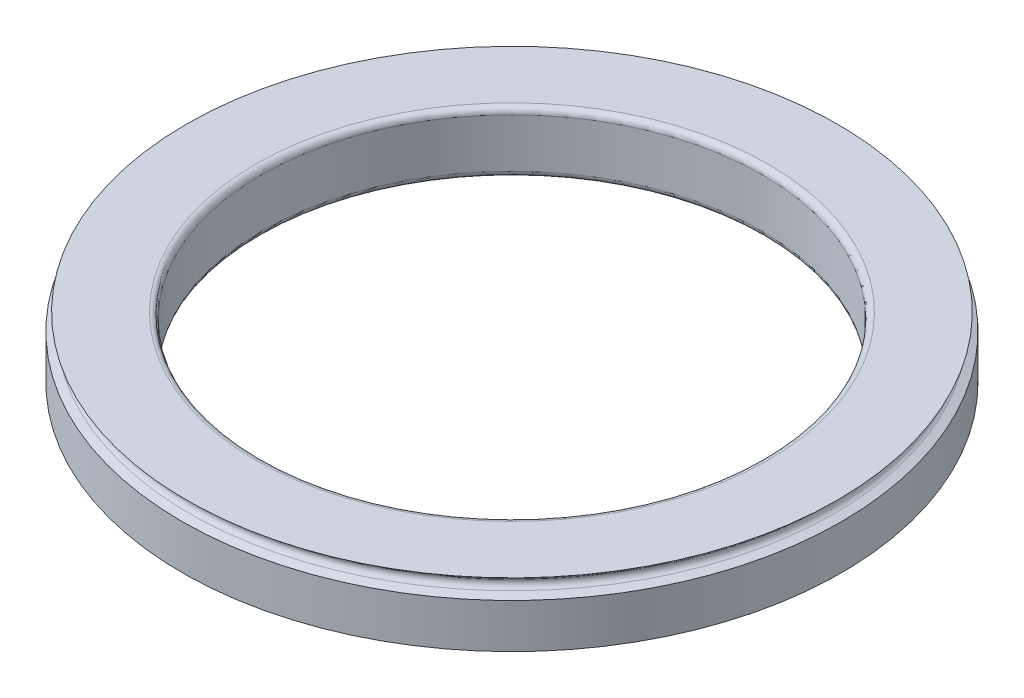
ISO-10303-21;
HEADER;
FILE_DESCRIPTION(('STEP AP214'),'2;1');
FILE_NAME('part.step','',(''),(''),'','','');
FILE_SCHEMA(('AUTOMOTIVE_DESIGN { 1 0 10303 214 1 1 1 1 }'));
ENDSEC;
DATA;
#1=APPLICATION_CONTEXT('core data for automotive mechanical design processes');
#2=APPLICATION_PROTOCOL_DEFINITION('international standard','automotive_design',2000,#1);
#3=PRODUCT_CONTEXT('',#1,'mechanical');
#4=PRODUCT('Part','Part','',(#3));
#5=PRODUCT_RELATED_PRODUCT_CATEGORY('part','',(#4));
#6=PRODUCT_DEFINITION_FORMATION('','',#4);
#7=PRODUCT_DEFINITION_CONTEXT('part definition',#1,'design');
#8=PRODUCT_DEFINITION('design','',#6,#7);
#9=PRODUCT_DEFINITION_SHAPE('','',#8);
#10=(LENGTH_UNIT() NAMED_UNIT(*) SI_UNIT(.MILLI.,.METRE.));
#11=(NAMED_UNIT(*) PLANE_ANGLE_UNIT() SI_UNIT($,.RADIAN.));
#12=(NAMED_UNIT(*) SI_UNIT($,.STERADIAN.) SOLID_ANGLE_UNIT());
#13=UNCERTAINTY_MEASURE_WITH_UNIT(LENGTH_MEASURE(1.E-05),#10,'distance_accuracy_value','');
#14=(GEOMETRIC_REPRESENTATION_CONTEXT(3) GLOBAL_UNCERTAINTY_ASSIGNED_CONTEXT((#13)) GLOBAL_UNIT_ASSIGNED_CONTEXT((#10,
#11,#12)) REPRESENTATION_CONTEXT('',''));
#15=CARTESIAN_POINT('',(0.,0.,0.));
#16=DIRECTION('',(0.,0.,1.));
#17=DIRECTION('',(1.,0.,0.));
#18=AXIS2_PLACEMENT_3D('',#15,#16,#17);
#19=CARTESIAN_POINT('',(42.43524478544,6.448403263981,-24.5));
#20=DIRECTION('',(0.,-1.,0.));
#21=DIRECTION('',(-0.500000000000017,0.,-0.866025403784429));
#22=AXIS2_PLACEMENT_3D('',#19,#20,#21);
#23=CONICAL_SURFACE('',#22,0.9037316479378,1.02974425867665);
#24=DIRECTION('',(0.42858365035107,-0.515038074910054,0.742328657701356));
#25=VECTOR('',#24,1.);
#26=CARTESIAN_POINT('',(42.8871106094089,6.448403263981,-23.7173454346819));
#27=LINE('',#26,#25);
#28=CARTESIAN_POINT('',(42.43524478544,6.991420021395,-24.5));
#29=VERTEX_POINT('',#28);
#30=CARTESIAN_POINT('',(43.26024478544,6.,-23.0710580837557));
#31=VERTEX_POINT('',#30);
#32=EDGE_CURVE('E11',#29,#31,#27,.T.);
#33=ORIENTED_EDGE('',*,*,#32,.T.);
#34=CARTESIAN_POINT('',(42.43524478544,6.,-24.5));
#35=DIRECTION('',(0.,-1.,0.));
#36=DIRECTION('',(-0.500000000000017,0.,-0.866025403784429));
#37=AXIS2_PLACEMENT_3D('',#34,#35,#36);
#38=CIRCLE('',#37,1.65);
#39=EDGE_CURVE('E189',#31,#31,#38,.T.);
#40=ORIENTED_EDGE('',*,*,#39,.T.);
#41=ORIENTED_EDGE('',*,*,#32,.F.);
#42=EDGE_LOOP('',(#33,#40,#41));
#43=FACE_BOUND('',#42,.T.);
#44=ADVANCED_FACE('F17',(#43),#23,.F.);
#45=CARTESIAN_POINT('',(42.43524478544,7.340991022465,-24.5));
#46=DIRECTION('',(0.,-1.,0.));
#47=DIRECTION('',(-0.500000000000017,0.,-0.866025403784429));
#48=AXIS2_PLACEMENT_3D('',#45,#46,#47);
#49=CYLINDRICAL_SURFACE('',#48,1.65);
#50=ORIENTED_EDGE('',*,*,#39,.F.);
#51=DIRECTION('',(0.,-1.,0.));
#52=VECTOR('',#51,1.);
#53=CARTESIAN_POINT('',(43.26024478544,7.340991022465,-23.0710580837557));
#54=LINE('',#53,#52);
#55=CARTESIAN_POINT('',(43.26024478544,0.,-23.0710580837557));
#56=VERTEX_POINT('',#55);
#57=EDGE_CURVE('E28',#31,#56,#54,.T.);
#58=ORIENTED_EDGE('',*,*,#57,.T.);
#59=CARTESIAN_POINT('',(42.43524478544,0.,-24.5));
#60=DIRECTION('',(0.,-1.,0.));
#61=DIRECTION('',(-0.500000000000017,0.,-0.866025403784429));
#62=AXIS2_PLACEMENT_3D('',#59,#60,#61);
#63=CIRCLE('',#62,1.65);
#64=EDGE_CURVE('E257',#56,#56,#63,.T.);
#65=ORIENTED_EDGE('',*,*,#64,.T.);
#66=ORIENTED_EDGE('',*,*,#57,.F.);
#67=EDGE_LOOP('',(#50,#58,#65,#66));
#68=FACE_BOUND('',#67,.T.);
#69=ADVANCED_FACE('F292',(#68),#49,.F.);
#70=CARTESIAN_POINT('',(42.43524478544,6.448403263981,24.5));
#71=DIRECTION('',(0.,-1.,0.));
#72=DIRECTION('',(0.500000000000017,0.,-0.866025403784429));
#73=AXIS2_PLACEMENT_3D('',#70,#71,#72);
#74=CONICAL_SURFACE('',#73,0.9037316479378,1.02974425867665);
#75=DIRECTION('',(-0.428583650351071,-0.515038074910054,0.742328657701356));
#76=VECTOR('',#75,1.);
#77=CARTESIAN_POINT('',(41.9833789614711,6.448403263981,25.2826545653181));
#78=LINE('',#77,#76);
#79=CARTESIAN_POINT('',(42.43524478544,6.991420021395,24.5));
#80=VERTEX_POINT('',#79);
#81=CARTESIAN_POINT('',(41.61024478544,6.,25.9289419162443));
#82=VERTEX_POINT('',#81);
#83=EDGE_CURVE('E184',#80,#82,#78,.T.);
#84=ORIENTED_EDGE('',*,*,#83,.T.);
#85=CARTESIAN_POINT('',(42.43524478544,6.,24.5));
#86=DIRECTION('',(0.,-1.,0.));
#87=DIRECTION('',(0.500000000000017,0.,-0.866025403784429));
#88=AXIS2_PLACEMENT_3D('',#85,#86,#87);
#89=CIRCLE('',#88,1.65);
#90=EDGE_CURVE('E185',#82,#82,#89,.T.);
#91=ORIENTED_EDGE('',*,*,#90,.T.);
#92=ORIENTED_EDGE('',*,*,#83,.F.);
#93=EDGE_LOOP('',(#84,#91,#92));
#94=FACE_BOUND('',#93,.T.);
#95=ADVANCED_FACE('F300',(#94),#74,.F.);
#96=CARTESIAN_POINT('',(42.43524478544,7.340991022465,24.5));
#97=DIRECTION('',(0.,-1.,0.));
#98=DIRECTION('',(0.500000000000017,0.,-0.866025403784429));
#99=AXIS2_PLACEMENT_3D('',#96,#97,#98);
#100=CYLINDRICAL_SURFACE('',#99,1.65);
#101=ORIENTED_EDGE('',*,*,#90,.F.);
#102=DIRECTION('',(0.,-1.,0.));
#103=VECTOR('',#102,1.);
#104=CARTESIAN_POINT('',(41.61024478544,7.340991022465,25.9289419162443));
#105=LINE('',#104,#103);
#106=CARTESIAN_POINT('',(41.61024478544,0.,25.9289419162443));
#107=VERTEX_POINT('',#106);
#108=EDGE_CURVE('E181',#82,#107,#105,.T.);
#109=ORIENTED_EDGE('',*,*,#108,.T.);
#110=CARTESIAN_POINT('',(42.43524478544,0.,24.5));
#111=DIRECTION('',(0.,-1.,0.));
#112=DIRECTION('',(0.500000000000017,0.,-0.866025403784429));
#113=AXIS2_PLACEMENT_3D('',#110,#111,#112);
#114=CIRCLE('',#113,1.65);
#115=EDGE_CURVE('E249',#107,#107,#114,.T.);
#116=ORIENTED_EDGE('',*,*,#115,.T.);
#117=ORIENTED_EDGE('',*,*,#108,.F.);
#118=EDGE_LOOP('',(#101,#109,#116,#117));
#119=FACE_BOUND('',#118,.T.);
#120=ADVANCED_FACE('F498',(#119),#100,.F.);
#121=CARTESIAN_POINT('',(0.,6.448403263981,49.));
#122=DIRECTION('',(0.,-1.,0.));
#123=DIRECTION('',(1.,0.,0.));
#124=AXIS2_PLACEMENT_3D('',#121,#122,#123);
#125=CONICAL_SURFACE('',#124,0.9037316479378,1.02974425867665);
#126=DIRECTION('',(-0.857167300702112,-0.515038074910054,0.));
#127=VECTOR('',#126,1.);
#128=CARTESIAN_POINT('',(-0.9037316479378,6.448403263981,49.));
#129=LINE('',#128,#127);
#130=CARTESIAN_POINT('',(0.,6.991420021395,49.));
#131=VERTEX_POINT('',#130);
#132=CARTESIAN_POINT('',(-1.65,6.,49.));
#133=VERTEX_POINT('',#132);
#134=EDGE_CURVE('E180',#131,#133,#129,.T.);
#135=ORIENTED_EDGE('',*,*,#134,.T.);
#136=CARTESIAN_POINT('',(0.,6.,49.));
#137=DIRECTION('',(0.,-1.,0.));
#138=DIRECTION('',(1.,0.,0.));
#139=AXIS2_PLACEMENT_3D('',#136,#137,#138);
#140=CIRCLE('',#139,1.65);
#141=EDGE_CURVE('E162',#133,#133,#140,.T.);
#142=ORIENTED_EDGE('',*,*,#141,.T.);
#143=ORIENTED_EDGE('',*,*,#134,.F.);
#144=EDGE_LOOP('',(#135,#142,#143));
#145=FACE_BOUND('',#144,.T.);
#146=ADVANCED_FACE('F492',(#145),#125,.F.);
#147=CARTESIAN_POINT('',(0.,7.340991022465,49.));
#148=DIRECTION('',(0.,-1.,0.));
#149=DIRECTION('',(1.,0.,0.));
#150=AXIS2_PLACEMENT_3D('',#147,#148,#149);
#151=CYLINDRICAL_SURFACE('',#150,1.65);
#152=ORIENTED_EDGE('',*,*,#141,.F.);
#153=DIRECTION('',(0.,-1.,0.));
#154=VECTOR('',#153,1.);
#155=CARTESIAN_POINT('',(-1.65,7.340991022465,49.));
#156=LINE('',#155,#154);
#157=CARTESIAN_POINT('',(-1.65,0.,49.));
#158=VERTEX_POINT('',#157);
#159=EDGE_CURVE('E171',#133,#158,#156,.T.);
#160=ORIENTED_EDGE('',*,*,#159,.T.);
#161=CARTESIAN_POINT('',(0.,0.,49.));
#162=DIRECTION('',(0.,-1.,0.));
#163=DIRECTION('',(1.,0.,0.));
#164=AXIS2_PLACEMENT_3D('',#161,#162,#163);
#165=CIRCLE('',#164,1.65);
#166=EDGE_CURVE('E245',#158,#158,#165,.T.);
#167=ORIENTED_EDGE('',*,*,#166,.T.);
#168=ORIENTED_EDGE('',*,*,#159,.F.);
#169=EDGE_LOOP('',(#152,#160,#167,#168));
#170=FACE_BOUND('',#169,.T.);
#171=ADVANCED_FACE('F497',(#170),#151,.F.);
#172=CARTESIAN_POINT('',(-42.43524478544,6.448403263981,24.5));
#173=DIRECTION('',(0.,-1.,0.));
#174=DIRECTION('',(0.500000000000017,0.,0.866025403784429));
#175=AXIS2_PLACEMENT_3D('',#172,#173,#174);
#176=CONICAL_SURFACE('',#175,0.9037316479378,1.02974425867665);
#177=DIRECTION('',(-0.42858365035107,-0.515038074910054,-0.742328657701356));
#178=VECTOR('',#177,1.);
#179=CARTESIAN_POINT('',(-42.8871106094089,6.448403263981,23.7173454346819));
#180=LINE('',#179,#178);
#181=CARTESIAN_POINT('',(-42.43524478544,6.991420021395,24.5));
#182=VERTEX_POINT('',#181);
#183=CARTESIAN_POINT('',(-43.26024478544,6.,23.0710580837557));
#184=VERTEX_POINT('',#183);
#185=EDGE_CURVE('E156',#182,#184,#180,.T.);
#186=ORIENTED_EDGE('',*,*,#185,.T.);
#187=CARTESIAN_POINT('',(-42.43524478544,6.,24.5));
#188=DIRECTION('',(0.,-1.,0.));
#189=DIRECTION('',(0.500000000000017,0.,0.866025403784429));
#190=AXIS2_PLACEMENT_3D('',#187,#188,#189);
#191=CIRCLE('',#190,1.65);
#192=EDGE_CURVE('E160',#184,#184,#191,.T.);
#193=ORIENTED_EDGE('',*,*,#192,.T.);
#194=ORIENTED_EDGE('',*,*,#185,.F.);
#195=EDGE_LOOP('',(#186,#193,#194));
#196=FACE_BOUND('',#195,.T.);
#197=ADVANCED_FACE('F157',(#196),#176,.F.);
#198=CARTESIAN_POINT('',(-42.43524478544,7.340991022465,24.5));
#199=DIRECTION('',(0.,-1.,0.));
#200=DIRECTION('',(0.500000000000017,0.,0.866025403784429));
#201=AXIS2_PLACEMENT_3D('',#198,#199,#200);
#202=CYLINDRICAL_SURFACE('',#201,1.65);
#203=ORIENTED_EDGE('',*,*,#192,.F.);
#204=DIRECTION('',(0.,-1.,0.));
#205=VECTOR('',#204,1.);
#206=CARTESIAN_POINT('',(-43.26024478544,7.340991022465,23.0710580837557));
#207=LINE('',#206,#205);
#208=CARTESIAN_POINT('',(-43.26024478544,0.,23.0710580837557));
#209=VERTEX_POINT('',#208);
#210=EDGE_CURVE('E163',#184,#209,#207,.T.);
#211=ORIENTED_EDGE('',*,*,#210,.T.);
#212=CARTESIAN_POINT('',(-42.43524478544,0.,24.5));
#213=DIRECTION('',(0.,-1.,0.));
#214=DIRECTION('',(0.500000000000017,0.,0.866025403784429));
#215=AXIS2_PLACEMENT_3D('',#212,#213,#214);
#216=CIRCLE('',#215,1.65);
#217=EDGE_CURVE('E238',#209,#209,#216,.T.);
#218=ORIENTED_EDGE('',*,*,#217,.T.);
#219=ORIENTED_EDGE('',*,*,#210,.F.);
#220=EDGE_LOOP('',(#203,#211,#218,#219));
#221=FACE_BOUND('',#220,.T.);
#222=ADVANCED_FACE('F304',(#221),#202,.F.);
#223=CARTESIAN_POINT('',(-42.43524478544,6.448403263981,-24.5));
#224=DIRECTION('',(0.,-1.,0.));
#225=DIRECTION('',(-0.500000000000017,0.,0.866025403784429));
#226=AXIS2_PLACEMENT_3D('',#223,#224,#225);
#227=CONICAL_SURFACE('',#226,0.9037316479378,1.02974425867665);
#228=DIRECTION('',(0.428583650351071,-0.515038074910054,-0.742328657701356));
#229=VECTOR('',#228,1.);
#230=CARTESIAN_POINT('',(-41.9833789614711,6.448403263981,-25.2826545653181));
#231=LINE('',#230,#229);
#232=CARTESIAN_POINT('',(-42.43524478544,6.991420021395,-24.5));
#233=VERTEX_POINT('',#232);
#234=CARTESIAN_POINT('',(-41.61024478544,6.,-25.9289419162443));
#235=VERTEX_POINT('',#234);
#236=EDGE_CURVE('E188',#233,#235,#231,.T.);
#237=ORIENTED_EDGE('',*,*,#236,.T.);
#238=CARTESIAN_POINT('',(-42.43524478544,6.,-24.5));
#239=DIRECTION('',(0.,-1.,0.));
#240=DIRECTION('',(-0.500000000000017,0.,0.866025403784429));
#241=AXIS2_PLACEMENT_3D('',#238,#239,#240);
#242=CIRCLE('',#241,1.65);
#243=EDGE_CURVE('E361',#235,#235,#242,.T.);
#244=ORIENTED_EDGE('',*,*,#243,.T.);
#245=ORIENTED_EDGE('',*,*,#236,.F.);
#246=EDGE_LOOP('',(#237,#244,#245));
#247=FACE_BOUND('',#246,.T.);
#248=ADVANCED_FACE('F508',(#247),#227,.F.);
#249=CARTESIAN_POINT('',(-42.43524478544,7.340991022465,-24.5));
#250=DIRECTION('',(0.,-1.,0.));
#251=DIRECTION('',(-0.500000000000017,0.,0.866025403784429));
#252=AXIS2_PLACEMENT_3D('',#249,#250,#251);
#253=CYLINDRICAL_SURFACE('',#252,1.65);
#254=ORIENTED_EDGE('',*,*,#243,.F.);
#255=DIRECTION('',(0.,-1.,0.));
#256=VECTOR('',#255,1.);
#257=CARTESIAN_POINT('',(-41.61024478544,7.340991022465,-25.9289419162443));
#258=LINE('',#257,#256);
#259=CARTESIAN_POINT('',(-41.61024478544,0.,-25.9289419162443));
#260=VERTEX_POINT('',#259);
#261=EDGE_CURVE('E176',#235,#260,#258,.T.);
#262=ORIENTED_EDGE('',*,*,#261,.T.);
#263=CARTESIAN_POINT('',(-42.43524478544,0.,-24.5));
#264=DIRECTION('',(0.,-1.,0.));
#265=DIRECTION('',(-0.500000000000017,0.,0.866025403784429));
#266=AXIS2_PLACEMENT_3D('',#263,#264,#265);
#267=CIRCLE('',#266,1.65);
#268=EDGE_CURVE('E234',#260,#260,#267,.T.);
#269=ORIENTED_EDGE('',*,*,#268,.T.);
#270=ORIENTED_EDGE('',*,*,#261,.F.);
#271=EDGE_LOOP('',(#254,#262,#269,#270));
#272=FACE_BOUND('',#271,.T.);
#273=ADVANCED_FACE('F469',(#272),#253,.F.);
#274=CARTESIAN_POINT('',(0.,6.448403263981,-49.));
#275=DIRECTION('',(0.,-1.,0.));
#276=DIRECTION('',(-1.,0.,0.));
#277=AXIS2_PLACEMENT_3D('',#274,#275,#276);
#278=CONICAL_SURFACE('',#277,0.9037316479378,1.02974425867665);
#279=DIRECTION('',(0.857167300702112,-0.515038074910054,0.));
#280=VECTOR('',#279,1.);
#281=CARTESIAN_POINT('',(0.9037316479378,6.448403263981,-49.));
#282=LINE('',#281,#280);
#283=CARTESIAN_POINT('',(0.,6.991420021395,-49.));
#284=VERTEX_POINT('',#283);
#285=CARTESIAN_POINT('',(1.65,6.,-49.));
#286=VERTEX_POINT('',#285);
#287=EDGE_CURVE('E252',#284,#286,#282,.T.);
#288=ORIENTED_EDGE('',*,*,#287,.T.);
#289=CARTESIAN_POINT('',(0.,6.,-49.));
#290=DIRECTION('',(0.,-1.,0.));
#291=DIRECTION('',(-1.,0.,0.));
#292=AXIS2_PLACEMENT_3D('',#289,#290,#291);
#293=CIRCLE('',#292,1.65);
#294=EDGE_CURVE('E228',#286,#286,#293,.T.);
#295=ORIENTED_EDGE('',*,*,#294,.T.);
#296=ORIENTED_EDGE('',*,*,#287,.F.);
#297=EDGE_LOOP('',(#288,#295,#296));
#298=FACE_BOUND('',#297,.T.);
#299=ADVANCED_FACE('F463',(#298),#278,.F.);
#300=CARTESIAN_POINT('',(0.,7.340991022465,-49.));
#301=DIRECTION('',(0.,-1.,0.));
#302=DIRECTION('',(-1.,0.,0.));
#303=AXIS2_PLACEMENT_3D('',#300,#301,#302);
#304=CYLINDRICAL_SURFACE('',#303,1.65);
#305=ORIENTED_EDGE('',*,*,#294,.F.);
#306=DIRECTION('',(0.,-1.,0.));
#307=VECTOR('',#306,1.);
#308=CARTESIAN_POINT('',(1.65,7.340991022465,-49.));
#309=LINE('',#308,#307);
#310=CARTESIAN_POINT('',(1.65,0.,-49.));
#311=VERTEX_POINT('',#310);
#312=EDGE_CURVE('E232',#286,#311,#309,.T.);
#313=ORIENTED_EDGE('',*,*,#312,.T.);
#314=CARTESIAN_POINT('',(0.,0.,-49.));
#315=DIRECTION('',(0.,-1.,0.));
#316=DIRECTION('',(-1.,0.,0.));
#317=AXIS2_PLACEMENT_3D('',#314,#315,#316);
#318=CIRCLE('',#317,1.65);
#319=EDGE_CURVE('E239',#311,#311,#318,.T.);
#320=ORIENTED_EDGE('',*,*,#319,.T.);
#321=ORIENTED_EDGE('',*,*,#312,.F.);
#322=EDGE_LOOP('',(#305,#313,#320,#321));
#323=FACE_BOUND('',#322,.T.);
#324=ADVANCED_FACE('F468',(#323),#304,.F.);
#325=CARTESIAN_POINT('',(0.,1.,0.));
#326=DIRECTION('',(0.,1.,0.));
#327=DIRECTION('',(-0.999983519769653,0.,-0.00574109650642973));
#328=AXIS2_PLACEMENT_3D('',#325,#326,#327);
#329=TOROIDAL_SURFACE('',#328,42.,1.);
#330=CARTESIAN_POINT('',(0.,0.,0.));
#331=DIRECTION('',(0.,1.,0.));
#332=DIRECTION('',(-1.,0.,0.));
#333=AXIS2_PLACEMENT_3D('',#330,#331,#332);
#334=CIRCLE('',#333,42.);
#335=CARTESIAN_POINT('',(41.9993078303254,0.,0.241126053270043));
#336=VERTEX_POINT('',#335);
#337=EDGE_CURVE('E253',#336,#336,#334,.T.);
#338=ORIENTED_EDGE('',*,*,#337,.F.);
#339=CARTESIAN_POINT('',(41.9993078303254,1.,0.241126053270043));
#340=DIRECTION('',(0.00574109650642961,0.,-0.999983519769653));
#341=DIRECTION('',(0.999983519769653,0.,0.00574109650642961));
#342=AXIS2_PLACEMENT_3D('',#339,#340,#341);
#343=CIRCLE('',#342,1.);
#344=CARTESIAN_POINT('',(40.9993243105558,1.,0.235384956763614));
#345=VERTEX_POINT('',#344);
#346=EDGE_CURVE('E233',#336,#345,#343,.T.);
#347=ORIENTED_EDGE('',*,*,#346,.T.);
#348=CARTESIAN_POINT('',(0.,1.,0.));
#349=DIRECTION('',(0.,1.,0.));
#350=DIRECTION('',(-1.,0.,0.));
#351=AXIS2_PLACEMENT_3D('',#348,#349,#350);
#352=CIRCLE('',#351,41.);
#353=CARTESIAN_POINT('',(-41.,1.,0.));
#354=VERTEX_POINT('',#353);
#355=EDGE_CURVE('E200',#345,#354,#352,.T.);
#356=ORIENTED_EDGE('',*,*,#355,.T.);
#357=CARTESIAN_POINT('',(0.,1.,0.));
#358=DIRECTION('',(0.,1.,0.));
#359=DIRECTION('',(-1.,0.,0.));
#360=AXIS2_PLACEMENT_3D('',#357,#358,#359);
#361=CIRCLE('',#360,41.);
#362=EDGE_CURVE('E203',#354,#345,#361,.T.);
#363=ORIENTED_EDGE('',*,*,#362,.T.);
#364=ORIENTED_EDGE('',*,*,#346,.F.);
#365=EDGE_LOOP('',(#338,#347,#356,#363,#364));
#366=FACE_BOUND('',#365,.T.);
#367=ADVANCED_FACE('F486',(#366),#329,.T.);
#368=CARTESIAN_POINT('',(0.,-0.5,0.));
#369=DIRECTION('',(0.,1.,0.));
#370=DIRECTION('',(1.,0.,0.));
#371=AXIS2_PLACEMENT_3D('',#368,#369,#370);
#372=CYLINDRICAL_SURFACE('',#371,41.);
#373=ORIENTED_EDGE('',*,*,#355,.F.);
#374=ORIENTED_EDGE('',*,*,#362,.F.);
#375=DIRECTION('',(0.,1.,0.));
#376=VECTOR('',#375,1.);
#377=CARTESIAN_POINT('',(-41.,-0.5,0.));
#378=LINE('',#377,#376);
#379=CARTESIAN_POINT('',(-41.,9.,0.));
#380=VERTEX_POINT('',#379);
#381=EDGE_CURVE('E212',#354,#380,#378,.T.);
#382=ORIENTED_EDGE('',*,*,#381,.T.);
#383=CARTESIAN_POINT('',(0.,9.,0.));
#384=DIRECTION('',(0.,1.,0.));
#385=DIRECTION('',(-1.,0.,0.));
#386=AXIS2_PLACEMENT_3D('',#383,#384,#385);
#387=CIRCLE('',#386,41.);
#388=CARTESIAN_POINT('',(40.9992575641347,9.,0.246737086275298));
#389=VERTEX_POINT('',#388);
#390=EDGE_CURVE('E204',#380,#389,#387,.T.);
#391=ORIENTED_EDGE('',*,*,#390,.T.);
#392=CARTESIAN_POINT('',(0.,9.,0.));
#393=DIRECTION('',(0.,1.,0.));
#394=DIRECTION('',(-1.,0.,0.));
#395=AXIS2_PLACEMENT_3D('',#392,#393,#394);
#396=CIRCLE('',#395,41.);
#397=EDGE_CURVE('E21',#389,#380,#396,.T.);
#398=ORIENTED_EDGE('',*,*,#397,.T.);
#399=ORIENTED_EDGE('',*,*,#381,.F.);
#400=EDGE_LOOP('',(#373,#374,#382,#391,#398,#399));
#401=FACE_BOUND('',#400,.T.);
#402=ADVANCED_FACE('F19',(#401),#372,.F.);
#403=CARTESIAN_POINT('',(0.,9.,0.));
#404=DIRECTION('',(0.,1.,0.));
#405=DIRECTION('',(-0.999981891808163,0.,-0.00601797771403178));
#406=AXIS2_PLACEMENT_3D('',#403,#404,#405);
#407=TOROIDAL_SURFACE('',#406,42.,1.);
#408=ORIENTED_EDGE('',*,*,#397,.F.);
#409=CARTESIAN_POINT('',(41.9992394559429,9.,0.25275506398933));
#410=DIRECTION('',(0.00601797771403166,0.,-0.999981891808163));
#411=DIRECTION('',(0.999981891808163,0.,0.00601797771403166));
#412=AXIS2_PLACEMENT_3D('',#409,#410,#411);
#413=CIRCLE('',#412,1.);
#414=CARTESIAN_POINT('',(41.9992394559429,10.,0.25275506398933));
#415=VERTEX_POINT('',#414);
#416=EDGE_CURVE('E214',#389,#415,#413,.T.);
#417=ORIENTED_EDGE('',*,*,#416,.T.);
#418=CARTESIAN_POINT('',(0.,10.,0.));
#419=DIRECTION('',(0.,1.,0.));
#420=DIRECTION('',(-1.,0.,0.));
#421=AXIS2_PLACEMENT_3D('',#418,#419,#420);
#422=CIRCLE('',#421,42.);
#423=EDGE_CURVE('E330',#415,#415,#422,.T.);
#424=ORIENTED_EDGE('',*,*,#423,.T.);
#425=ORIENTED_EDGE('',*,*,#416,.F.);
#426=ORIENTED_EDGE('',*,*,#390,.F.);
#427=EDGE_LOOP('',(#408,#417,#424,#425,#426));
#428=FACE_BOUND('',#427,.T.);
#429=ADVANCED_FACE('F317',(#428),#407,.T.);
#430=CARTESIAN_POINT('',(0.,10.,0.));
#431=DIRECTION('',(0.,1.,0.));
#432=DIRECTION('',(1.,0.,0.));
#433=AXIS2_PLACEMENT_3D('',#430,#431,#432);
#434=PLANE('',#433);
#435=ORIENTED_EDGE('',*,*,#423,.F.);
#436=EDGE_LOOP('',(#435));
#437=FACE_BOUND('',#436,.T.);
#438=CARTESIAN_POINT('',(0.,10.,0.));
#439=DIRECTION('',(0.,1.,0.));
#440=DIRECTION('',(1.,0.,0.));
#441=AXIS2_PLACEMENT_3D('',#438,#439,#440);
#442=CIRCLE('',#441,53.34);
#443=CARTESIAN_POINT('',(-53.3400000000006,9.99999999999909,0.));
#444=VERTEX_POINT('',#443);
#445=EDGE_CURVE('E198',#444,#444,#442,.T.);
#446=ORIENTED_EDGE('',*,*,#445,.T.);
#447=EDGE_LOOP('',(#446));
#448=FACE_BOUND('',#447,.T.);
#449=ADVANCED_FACE('F315',(#437,#448),#434,.T.);
#450=CARTESIAN_POINT('',(0.,9.769439363259,0.));
#451=DIRECTION('',(0.,1.,0.));
#452=DIRECTION('',(1.,0.,0.));
#453=AXIS2_PLACEMENT_3D('',#450,#451,#452);
#454=CONICAL_SURFACE('',#453,52.97806204738,1.00360219003479);
#455=ORIENTED_EDGE('',*,*,#445,.F.);
#456=DIRECTION('',(0.843411792818451,-0.537267668611063,0.));
#457=VECTOR('',#456,1.);
#458=CARTESIAN_POINT('',(-52.97806204738,9.769439363259,0.));
#459=LINE('',#458,#457);
#460=CARTESIAN_POINT('',(-52.61612409476,9.538878726518,0.));
#461=VERTEX_POINT('',#460);
#462=EDGE_CURVE('E227',#444,#461,#459,.T.);
#463=ORIENTED_EDGE('',*,*,#462,.T.);
#464=CARTESIAN_POINT('',(0.,9.538878726518,0.));
#465=DIRECTION('',(0.,-1.,0.));
#466=DIRECTION('',(-1.,0.,0.));
#467=AXIS2_PLACEMENT_3D('',#464,#465,#466);
#468=CIRCLE('',#467,52.61612409476);
#469=CARTESIAN_POINT('',(52.6156289511733,9.538878726518,-0.22826481910826));
#470=VERTEX_POINT('',#469);
#471=EDGE_CURVE('E195',#470,#461,#468,.T.);
#472=ORIENTED_EDGE('',*,*,#471,.F.);
#473=CARTESIAN_POINT('',(0.,9.538878726518,0.));
#474=DIRECTION('',(0.,-1.,0.));
#475=DIRECTION('',(-1.,0.,0.));
#476=AXIS2_PLACEMENT_3D('',#473,#474,#475);
#477=CIRCLE('',#476,52.61612409476);
#478=EDGE_CURVE('E243',#461,#470,#477,.T.);
#479=ORIENTED_EDGE('',*,*,#478,.F.);
#480=ORIENTED_EDGE('',*,*,#462,.F.);
#481=EDGE_LOOP('',(#455,#463,#472,#479,#480));
#482=FACE_BOUND('',#481,.T.);
#483=ADVANCED_FACE('F313',(#482),#454,.T.);
#484=CARTESIAN_POINT('',(0.,8.6954669337,0.));
#485=DIRECTION('',(0.,1.,0.));
#486=DIRECTION('',(-0.999990589508534,0.,0.00433830547261815));
#487=AXIS2_PLACEMENT_3D('',#484,#485,#486);
#488=TOROIDAL_SURFACE('',#487,53.15339176337,1.);
#489=ORIENTED_EDGE('',*,*,#478,.T.);
#490=CARTESIAN_POINT('',(53.1528915638305,8.6954669337,-0.230595650375251));
#491=DIRECTION('',(0.00433830547261827,0.,0.999990589508534));
#492=DIRECTION('',(0.999990589508534,0.,-0.00433830547261827));
#493=AXIS2_PLACEMENT_3D('',#490,#491,#492);
#494=CIRCLE('',#493,1.);
#495=CARTESIAN_POINT('',(52.7682797986302,7.772390010623,-0.228927071347301));
#496=VERTEX_POINT('',#495);
#497=EDGE_CURVE('E199',#470,#496,#494,.T.);
#498=ORIENTED_EDGE('',*,*,#497,.T.);
#499=CARTESIAN_POINT('',(0.,7.772390010623,0.));
#500=DIRECTION('',(0.,-1.,0.));
#501=DIRECTION('',(-1.,0.,0.));
#502=AXIS2_PLACEMENT_3D('',#499,#500,#501);
#503=CIRCLE('',#502,52.76877637875);
#504=CARTESIAN_POINT('',(52.768776378751,7.77239001062541,0.));
#505=VERTEX_POINT('',#504);
#506=EDGE_CURVE('E244',#505,#496,#503,.T.);
#507=ORIENTED_EDGE('',*,*,#506,.F.);
#508=CARTESIAN_POINT('',(0.,7.772390010623,0.));
#509=DIRECTION('',(0.,-1.,0.));
#510=DIRECTION('',(-1.,0.,0.));
#511=AXIS2_PLACEMENT_3D('',#508,#509,#510);
#512=CIRCLE('',#511,52.76877637875);
#513=EDGE_CURVE('E240',#496,#505,#512,.T.);
#514=ORIENTED_EDGE('',*,*,#513,.F.);
#515=ORIENTED_EDGE('',*,*,#497,.F.);
#516=ORIENTED_EDGE('',*,*,#471,.T.);
#517=EDGE_LOOP('',(#489,#498,#507,#514,#515,#516));
#518=FACE_BOUND('',#517,.T.);
#519=ADVANCED_FACE('F311',(#518),#488,.F.);
#520=CARTESIAN_POINT('',(0.,7.51588508953,0.));
#521=DIRECTION('',(0.,-1.,0.));
#522=DIRECTION('',(-1.,0.,0.));
#523=AXIS2_PLACEMENT_3D('',#520,#521,#522);
#524=CONICAL_SURFACE('',#523,53.38438818938,1.17600520709514);
#525=CARTESIAN_POINT('',(0.,7.259380168436,0.));
#526=DIRECTION('',(0.,-1.,0.));
#527=DIRECTION('',(1.,0.,0.));
#528=AXIS2_PLACEMENT_3D('',#525,#526,#527);
#529=CIRCLE('',#528,54.);
#530=CARTESIAN_POINT('',(-54.,7.259380168436,0.));
#531=VERTEX_POINT('',#530);
#532=CARTESIAN_POINT('',(54.0000000000008,7.25938016843799,0.));
#533=VERTEX_POINT('',#532);
#534=EDGE_CURVE('E256',#531,#533,#529,.T.);
#535=ORIENTED_EDGE('',*,*,#534,.F.);
#536=CARTESIAN_POINT('',(0.,7.259380168436,0.));
#537=DIRECTION('',(0.,-1.,0.));
#538=DIRECTION('',(1.,0.,0.));
#539=AXIS2_PLACEMENT_3D('',#536,#537,#538);
#540=CIRCLE('',#539,54.);
#541=EDGE_CURVE('E270',#533,#531,#540,.T.);
#542=ORIENTED_EDGE('',*,*,#541,.F.);
#543=DIRECTION('',(-0.923076923076926,0.384615384615378,0.));
#544=VECTOR('',#543,1.);
#545=CARTESIAN_POINT('',(53.38438818938,7.51588508953,0.));
#546=LINE('',#545,#544);
#547=EDGE_CURVE('E258',#533,#505,#546,.T.);
#548=ORIENTED_EDGE('',*,*,#547,.T.);
#549=ORIENTED_EDGE('',*,*,#506,.T.);
#550=ORIENTED_EDGE('',*,*,#513,.T.);
#551=ORIENTED_EDGE('',*,*,#547,.F.);
#552=EDGE_LOOP('',(#535,#542,#548,#549,#550,#551));
#553=FACE_BOUND('',#552,.T.);
#554=ADVANCED_FACE('F310',(#553),#524,.T.);
#555=CARTESIAN_POINT('',(0.,-0.5,0.));
#556=DIRECTION('',(0.,1.,0.));
#557=DIRECTION('',(1.,0.,0.));
#558=AXIS2_PLACEMENT_3D('',#555,#556,#557);
#559=CYLINDRICAL_SURFACE('',#558,54.);
#560=ORIENTED_EDGE('',*,*,#534,.T.);
#561=ORIENTED_EDGE('',*,*,#541,.T.);
#562=DIRECTION('',(0.,-1.,0.));
#563=VECTOR('',#562,1.);
#564=CARTESIAN_POINT('',(-54.,-0.5,0.));
#565=LINE('',#564,#563);
#566=CARTESIAN_POINT('',(-54.,0.,0.));
#567=VERTEX_POINT('',#566);
#568=EDGE_CURVE('E261',#531,#567,#565,.T.);
#569=ORIENTED_EDGE('',*,*,#568,.T.);
#570=CARTESIAN_POINT('',(0.,0.,0.));
#571=DIRECTION('',(0.,-1.,0.));
#572=DIRECTION('',(1.,0.,0.));
#573=AXIS2_PLACEMENT_3D('',#570,#571,#572);
#574=CIRCLE('',#573,54.);
#575=EDGE_CURVE('E342',#567,#567,#574,.T.);
#576=ORIENTED_EDGE('',*,*,#575,.F.);
#577=ORIENTED_EDGE('',*,*,#568,.F.);
#578=EDGE_LOOP('',(#560,#561,#569,#576,#577));
#579=FACE_BOUND('',#578,.T.);
#580=ADVANCED_FACE('F306',(#579),#559,.T.);
#581=CARTESIAN_POINT('',(0.,0.,0.));
#582=DIRECTION('',(0.,1.,0.));
#583=DIRECTION('',(1.,0.,0.));
#584=AXIS2_PLACEMENT_3D('',#581,#582,#583);
#585=PLANE('',#584);
#586=ORIENTED_EDGE('',*,*,#337,.T.);
#587=EDGE_LOOP('',(#586));
#588=FACE_BOUND('',#587,.T.);
#589=ORIENTED_EDGE('',*,*,#64,.F.);
#590=EDGE_LOOP('',(#589));
#591=FACE_BOUND('',#590,.T.);
#592=ORIENTED_EDGE('',*,*,#115,.F.);
#593=EDGE_LOOP('',(#592));
#594=FACE_BOUND('',#593,.T.);
#595=ORIENTED_EDGE('',*,*,#166,.F.);
#596=EDGE_LOOP('',(#595));
#597=FACE_BOUND('',#596,.T.);
#598=ORIENTED_EDGE('',*,*,#217,.F.);
#599=EDGE_LOOP('',(#598));
#600=FACE_BOUND('',#599,.T.);
#601=ORIENTED_EDGE('',*,*,#268,.F.);
#602=EDGE_LOOP('',(#601));
#603=FACE_BOUND('',#602,.T.);
#604=ORIENTED_EDGE('',*,*,#319,.F.);
#605=EDGE_LOOP('',(#604));
#606=FACE_BOUND('',#605,.T.);
#607=ORIENTED_EDGE('',*,*,#575,.T.);
#608=EDGE_LOOP('',(#607));
#609=FACE_BOUND('',#608,.T.);
#610=ADVANCED_FACE('F309',(#588,#591,#594,#597,#600,#603,#606,#609),#585,.F.);
#611=CLOSED_SHELL('',(#44,#69,#95,#120,#146,#171,#197,#222,#248,#273,#299,#324,#367,#402,#429,
#449,#483,#519,#554,#580,#610));
#612=MANIFOLD_SOLID_BREP('B1',#611);
#613=ADVANCED_BREP_SHAPE_REPRESENTATION('',(#18,#612),#14);
#614=SHAPE_DEFINITION_REPRESENTATION(#9,#613);
ENDSEC;
END-ISO-10303-21;
